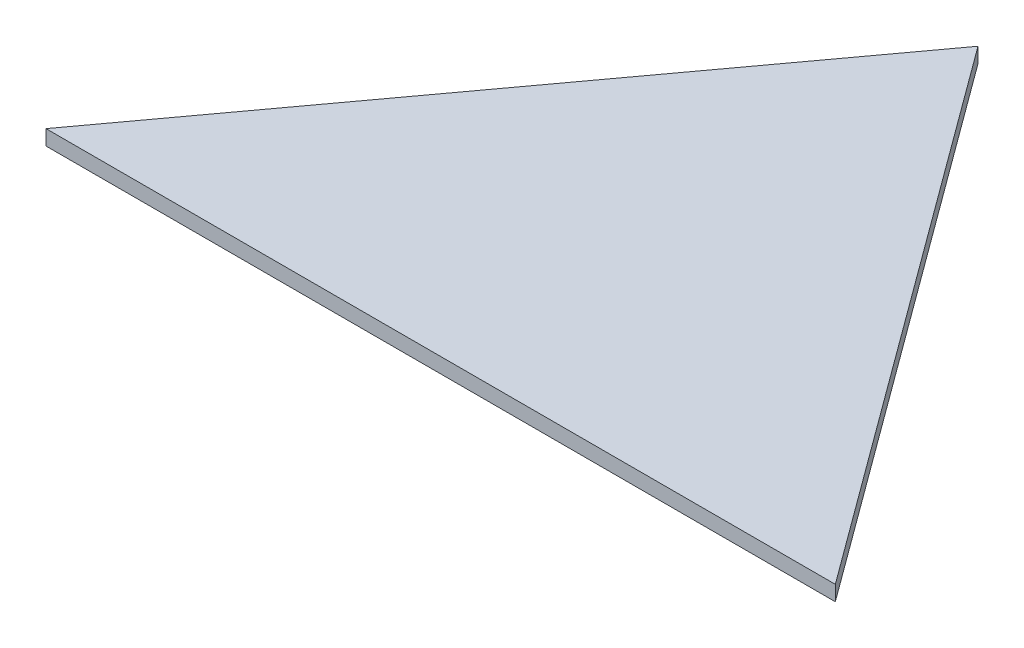
ISO-10303-21;
HEADER;
FILE_DESCRIPTION(('STEP AP214'),'2;1');
FILE_NAME('part.step','',(''),(''),'','','');
FILE_SCHEMA(('AUTOMOTIVE_DESIGN { 1 0 10303 214 1 1 1 1 }'));
ENDSEC;
DATA;
#1=APPLICATION_CONTEXT('core data for automotive mechanical design processes');
#2=APPLICATION_PROTOCOL_DEFINITION('international standard','automotive_design',2000,#1);
#3=PRODUCT_CONTEXT('',#1,'mechanical');
#4=PRODUCT('Part','Part','',(#3));
#5=PRODUCT_RELATED_PRODUCT_CATEGORY('part','',(#4));
#6=PRODUCT_DEFINITION_FORMATION('','',#4);
#7=PRODUCT_DEFINITION_CONTEXT('part definition',#1,'design');
#8=PRODUCT_DEFINITION('design','',#6,#7);
#9=PRODUCT_DEFINITION_SHAPE('','',#8);
#10=(LENGTH_UNIT() NAMED_UNIT(*) SI_UNIT(.MILLI.,.METRE.));
#11=(NAMED_UNIT(*) PLANE_ANGLE_UNIT() SI_UNIT($,.RADIAN.));
#12=(NAMED_UNIT(*) SI_UNIT($,.STERADIAN.) SOLID_ANGLE_UNIT());
#13=UNCERTAINTY_MEASURE_WITH_UNIT(LENGTH_MEASURE(1.E-05),#10,'distance_accuracy_value','');
#14=(GEOMETRIC_REPRESENTATION_CONTEXT(3) GLOBAL_UNCERTAINTY_ASSIGNED_CONTEXT((#13)) GLOBAL_UNIT_ASSIGNED_CONTEXT((#10,
#11,#12)) REPRESENTATION_CONTEXT('',''));
#15=CARTESIAN_POINT('',(0.,0.,0.));
#16=DIRECTION('',(0.,0.,1.));
#17=DIRECTION('',(1.,0.,0.));
#18=AXIS2_PLACEMENT_3D('',#15,#16,#17);
#19=CARTESIAN_POINT('',(67.745579749633,67.859000927449,2.020249533139));
#20=DIRECTION('',(-8.74227765734797E-08,0.999999999999996,0.));
#21=DIRECTION('',(-0.999999999999996,-8.74227765734797E-08,0.));
#22=AXIS2_PLACEMENT_3D('',#19,#20,#21);
#23=PLANE('',#22);
#24=DIRECTION('',(-0.591955733274022,0.,0.80597047703003));
#25=VECTOR('',#24,1.);
#26=CARTESIAN_POINT('',(67.745579749633,67.859000927449,1.605189650449));
#27=LINE('',#26,#25);
#28=CARTESIAN_POINT('',(67.7455797495028,67.8590009371623,1.60518965062624));
#29=VERTEX_POINT('',#28);
#30=CARTESIAN_POINT('',(67.3011462250551,67.8590008983087,2.21030297122388));
#31=VERTEX_POINT('',#30);
#32=EDGE_CURVE('E52',#29,#31,#27,.T.);
#33=ORIENTED_EDGE('',*,*,#32,.F.);
#34=DIRECTION('',(-0.591955733274022,0.,-0.80597047703003));
#35=VECTOR('',#34,1.);
#36=CARTESIAN_POINT('',(68.19001327384,67.859000966302,2.210302971224));
#37=LINE('',#36,#35);
#38=CARTESIAN_POINT('',(68.1900132737098,67.8590009468756,2.21030297104676));
#39=VERTEX_POINT('',#38);
#40=EDGE_CURVE('E53',#39,#29,#37,.T.);
#41=ORIENTED_EDGE('',*,*,#40,.F.);
#42=DIRECTION('',(1.,0.,0.));
#43=VECTOR('',#42,1.);
#44=CARTESIAN_POINT('',(67.301146225427,67.859000888595,2.210302971224));
#45=LINE('',#44,#43);
#46=EDGE_CURVE('E20',#31,#39,#45,.T.);
#47=ORIENTED_EDGE('',*,*,#46,.F.);
#48=EDGE_LOOP('',(#33,#41,#47));
#49=FACE_BOUND('',#48,.T.);
#50=ADVANCED_FACE('F17',(#49),#23,.F.);
#51=CARTESIAN_POINT('',(67.301146225427,67.859000888595,2.210302971224));
#52=DIRECTION('',(0.,0.,1.));
#53=DIRECTION('',(0.,-1.,0.));
#54=AXIS2_PLACEMENT_3D('',#51,#52,#53);
#55=PLANE('',#54);
#56=DIRECTION('',(-0.999999999999996,-8.74227765734797E-08,0.));
#57=VECTOR('',#56,1.);
#58=CARTESIAN_POINT('',(67.745579748147,67.876000927449,2.210302971224));
#59=LINE('',#58,#57);
#60=CARTESIAN_POINT('',(67.3011462240702,67.8760009274486,2.21030297104662));
#61=VERTEX_POINT('',#60);
#62=CARTESIAN_POINT('',(68.190013273097,67.8760009565889,2.21030297122402));
#63=VERTEX_POINT('',#62);
#64=EDGE_CURVE('E60',#61,#63,#59,.F.);
#65=ORIENTED_EDGE('',*,*,#64,.F.);
#66=DIRECTION('',(-5.67888225244643E-08,0.999999999999998,-4.17093057838954E-08));
#67=VECTOR('',#66,1.);
#68=CARTESIAN_POINT('',(67.3011462254264,67.859000927449,2.21030297122352));
#69=LINE('',#68,#67);
#70=EDGE_CURVE('E57',#31,#61,#69,.T.);
#71=ORIENTED_EDGE('',*,*,#70,.F.);
#72=ORIENTED_EDGE('',*,*,#46,.T.);
#73=DIRECTION('',(-5.67888223125828E-08,0.999999999999998,4.17093056282762E-08));
#74=VECTOR('',#73,1.);
#75=CARTESIAN_POINT('',(68.1900132733193,67.859000966302,2.21030297051503));
#76=LINE('',#75,#74);
#77=EDGE_CURVE('E64',#63,#39,#76,.F.);
#78=ORIENTED_EDGE('',*,*,#77,.F.);
#79=EDGE_LOOP('',(#65,#71,#72,#78));
#80=FACE_BOUND('',#79,.T.);
#81=ADVANCED_FACE('F58',(#80),#55,.T.);
#82=CARTESIAN_POINT('',(68.19001327384,67.859000966302,2.210302971224));
#83=DIRECTION('',(0.805970477030028,7.04601768067825E-08,-0.591955733274021));
#84=DIRECTION('',(-0.591955733274022,0.,-0.80597047703003));
#85=AXIS2_PLACEMENT_3D('',#82,#83,#84);
#86=PLANE('',#85);
#87=DIRECTION('',(-0.591955733274036,-5.17504165837577E-08,-0.805970477030018));
#88=VECTOR('',#87,1.);
#89=CARTESIAN_POINT('',(68.190013272354,67.8760009663026,2.210302971224));
#90=LINE('',#89,#88);
#91=CARTESIAN_POINT('',(67.7455797484073,67.8760009177355,1.6051896508035));
#92=VERTEX_POINT('',#91);
#93=EDGE_CURVE('E26',#63,#92,#90,.T.);
#94=ORIENTED_EDGE('',*,*,#93,.F.);
#95=ORIENTED_EDGE('',*,*,#77,.T.);
#96=ORIENTED_EDGE('',*,*,#40,.T.);
#97=DIRECTION('',(-5.67888225244643E-08,0.999999999999998,-4.17093057838954E-08));
#98=VECTOR('',#97,1.);
#99=CARTESIAN_POINT('',(67.7455797491123,67.859000927449,1.60518965115797));
#100=LINE('',#99,#98);
#101=EDGE_CURVE('E35',#92,#29,#100,.F.);
#102=ORIENTED_EDGE('',*,*,#101,.F.);
#103=EDGE_LOOP('',(#94,#95,#96,#102));
#104=FACE_BOUND('',#103,.T.);
#105=ADVANCED_FACE('F68',(#104),#86,.T.);
#106=CARTESIAN_POINT('',(67.745579749633,67.859000927449,1.605189650449));
#107=DIRECTION('',(-0.805970477030028,-7.04601770696725E-08,-0.591955733274021));
#108=DIRECTION('',(-0.591955733274022,0.,0.80597047703003));
#109=AXIS2_PLACEMENT_3D('',#106,#107,#108);
#110=PLANE('',#109);
#111=DIRECTION('',(-0.591955733274024,-5.17504165837583E-08,0.805970477030027));
#112=VECTOR('',#111,1.);
#113=CARTESIAN_POINT('',(67.745579748147,67.876000927449,1.605189650449));
#114=LINE('',#113,#112);
#115=EDGE_CURVE('E11',#92,#61,#114,.T.);
#116=ORIENTED_EDGE('',*,*,#115,.F.);
#117=ORIENTED_EDGE('',*,*,#101,.T.);
#118=ORIENTED_EDGE('',*,*,#32,.T.);
#119=ORIENTED_EDGE('',*,*,#70,.T.);
#120=EDGE_LOOP('',(#116,#117,#118,#119));
#121=FACE_BOUND('',#120,.T.);
#122=ADVANCED_FACE('F63',(#121),#110,.T.);
#123=CARTESIAN_POINT('',(67.745579748147,67.876000927449,2.020249533139));
#124=DIRECTION('',(-8.74227765734797E-08,0.999999999999996,0.));
#125=DIRECTION('',(-0.999999999999996,-8.74227765734797E-08,0.));
#126=AXIS2_PLACEMENT_3D('',#123,#124,#125);
#127=PLANE('',#126);
#128=ORIENTED_EDGE('',*,*,#93,.T.);
#129=ORIENTED_EDGE('',*,*,#115,.T.);
#130=ORIENTED_EDGE('',*,*,#64,.T.);
#131=EDGE_LOOP('',(#128,#129,#130));
#132=FACE_BOUND('',#131,.T.);
#133=ADVANCED_FACE('F72',(#132),#127,.T.);
#134=CLOSED_SHELL('',(#50,#81,#105,#122,#133));
#135=MANIFOLD_SOLID_BREP('B1',#134);
#136=ADVANCED_BREP_SHAPE_REPRESENTATION('',(#18,#135),#14);
#137=SHAPE_DEFINITION_REPRESENTATION(#9,#136);
ENDSEC;
END-ISO-10303-21;
